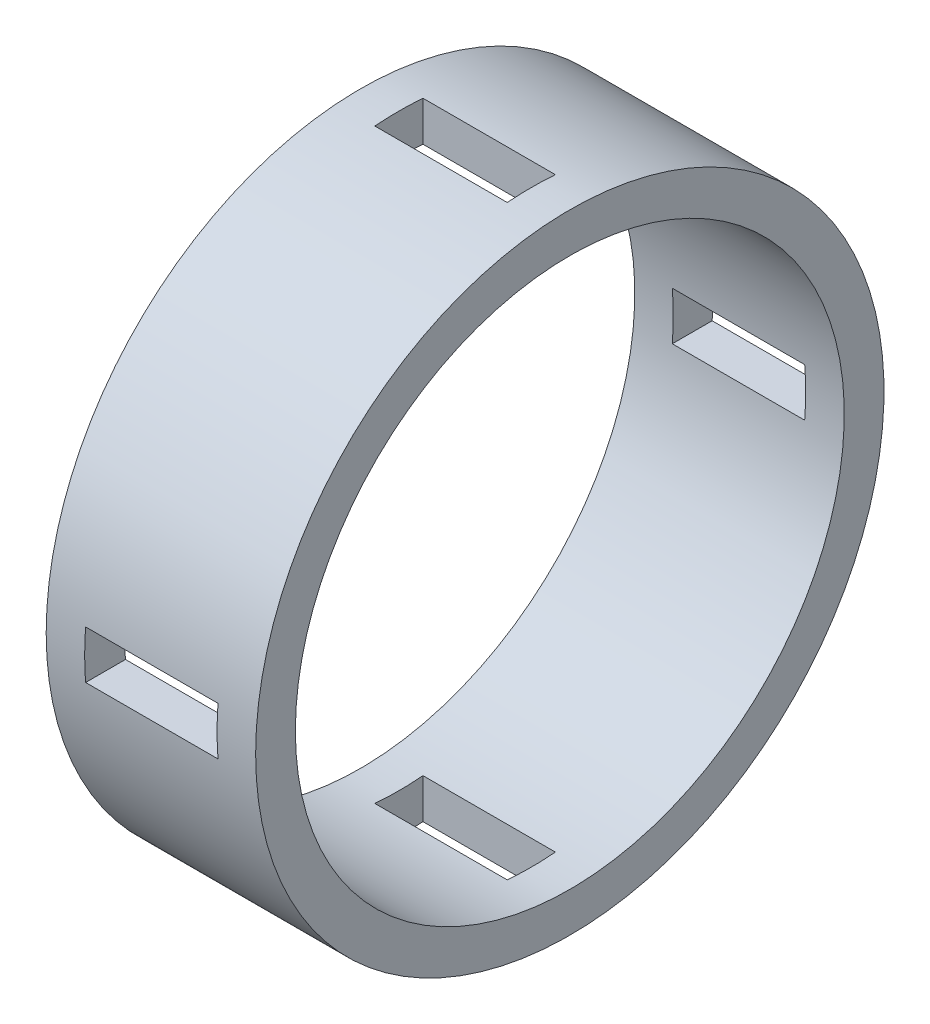
ISO-10303-21;
HEADER;
FILE_DESCRIPTION(('STEP AP214'),'2;1');
FILE_NAME('part.step','',(''),(''),'','','');
FILE_SCHEMA(('AUTOMOTIVE_DESIGN { 1 0 10303 214 1 1 1 1 }'));
ENDSEC;
DATA;
#1=APPLICATION_CONTEXT('core data for automotive mechanical design processes');
#2=APPLICATION_PROTOCOL_DEFINITION('international standard','automotive_design',2000,#1);
#3=PRODUCT_CONTEXT('',#1,'mechanical');
#4=PRODUCT('Part','Part','',(#3));
#5=PRODUCT_RELATED_PRODUCT_CATEGORY('part','',(#4));
#6=PRODUCT_DEFINITION_FORMATION('','',#4);
#7=PRODUCT_DEFINITION_CONTEXT('part definition',#1,'design');
#8=PRODUCT_DEFINITION('design','',#6,#7);
#9=PRODUCT_DEFINITION_SHAPE('','',#8);
#10=(LENGTH_UNIT() NAMED_UNIT(*) SI_UNIT(.MILLI.,.METRE.));
#11=(NAMED_UNIT(*) PLANE_ANGLE_UNIT() SI_UNIT($,.RADIAN.));
#12=(NAMED_UNIT(*) SI_UNIT($,.STERADIAN.) SOLID_ANGLE_UNIT());
#13=UNCERTAINTY_MEASURE_WITH_UNIT(LENGTH_MEASURE(1.E-05),#10,'distance_accuracy_value','');
#14=(GEOMETRIC_REPRESENTATION_CONTEXT(3) GLOBAL_UNCERTAINTY_ASSIGNED_CONTEXT((#13)) GLOBAL_UNIT_ASSIGNED_CONTEXT((#10,
#11,#12)) REPRESENTATION_CONTEXT('',''));
#15=CARTESIAN_POINT('',(0.,0.,0.));
#16=DIRECTION('',(0.,0.,1.));
#17=DIRECTION('',(1.,0.,0.));
#18=AXIS2_PLACEMENT_3D('',#15,#16,#17);
#19=CARTESIAN_POINT('',(31.05,2.,-24.5));
#20=DIRECTION('',(0.,-1.,0.));
#21=DIRECTION('',(0.,0.,-1.));
#22=AXIS2_PLACEMENT_3D('',#19,#20,#21);
#23=PLANE('',#22);
#24=DIRECTION('',(-1.,0.,0.));
#25=VECTOR('',#24,1.);
#26=CARTESIAN_POINT('',(31.05,2.00000000000001,-22.7121113065254));
#27=LINE('',#26,#25);
#28=CARTESIAN_POINT('',(36.55,2.,-22.7121113065254));
#29=VERTEX_POINT('',#28);
#30=CARTESIAN_POINT('',(25.55,2.,-22.7121113065254));
#31=VERTEX_POINT('',#30);
#32=EDGE_CURVE('E156',#29,#31,#27,.T.);
#33=ORIENTED_EDGE('',*,*,#32,.T.);
#34=DIRECTION('',(0.,0.,1.));
#35=VECTOR('',#34,1.);
#36=CARTESIAN_POINT('',(25.55,2.,-24.5));
#37=LINE('',#36,#35);
#38=CARTESIAN_POINT('',(25.55,2.,-26.0232588274413));
#39=VERTEX_POINT('',#38);
#40=EDGE_CURVE('E217',#39,#31,#37,.T.);
#41=ORIENTED_EDGE('',*,*,#40,.F.);
#42=DIRECTION('',(-1.,0.,0.));
#43=VECTOR('',#42,1.);
#44=CARTESIAN_POINT('',(31.05,1.99999999999999,-26.0232588274413));
#45=LINE('',#44,#43);
#46=CARTESIAN_POINT('',(36.55,2.,-26.0232588274413));
#47=VERTEX_POINT('',#46);
#48=EDGE_CURVE('E205',#47,#39,#45,.T.);
#49=ORIENTED_EDGE('',*,*,#48,.F.);
#50=DIRECTION('',(0.,0.,1.));
#51=VECTOR('',#50,1.);
#52=CARTESIAN_POINT('',(36.55,2.,-24.5));
#53=LINE('',#52,#51);
#54=EDGE_CURVE('E213',#47,#29,#53,.T.);
#55=ORIENTED_EDGE('',*,*,#54,.T.);
#56=EDGE_LOOP('',(#33,#41,#49,#55));
#57=FACE_BOUND('',#56,.T.);
#58=ADVANCED_FACE('F16',(#57),#23,.T.);
#59=CARTESIAN_POINT('',(25.55,24.5,0.));
#60=DIRECTION('',(1.,0.,0.));
#61=DIRECTION('',(0.,1.,0.));
#62=AXIS2_PLACEMENT_3D('',#59,#60,#61);
#63=PLANE('',#62);
#64=CARTESIAN_POINT('',(25.55,0.,0.));
#65=DIRECTION('',(-1.,0.,0.));
#66=DIRECTION('',(0.,0.,1.));
#67=AXIS2_PLACEMENT_3D('',#64,#65,#66);
#68=CIRCLE('',#67,22.8);
#69=CARTESIAN_POINT('',(25.55,22.7121113065254,2.));
#70=VERTEX_POINT('',#69);
#71=CARTESIAN_POINT('',(25.55,22.7121113065254,-2.));
#72=VERTEX_POINT('',#71);
#73=EDGE_CURVE('E151',#70,#72,#68,.T.);
#74=ORIENTED_EDGE('',*,*,#73,.T.);
#75=DIRECTION('',(0.,-1.,0.));
#76=VECTOR('',#75,1.);
#77=CARTESIAN_POINT('',(25.55,24.5,-2.));
#78=LINE('',#77,#76);
#79=CARTESIAN_POINT('',(25.55,26.0232588274413,-2.));
#80=VERTEX_POINT('',#79);
#81=EDGE_CURVE('E238',#80,#72,#78,.T.);
#82=ORIENTED_EDGE('',*,*,#81,.F.);
#83=CARTESIAN_POINT('',(25.55,0.,0.));
#84=DIRECTION('',(-1.,0.,0.));
#85=DIRECTION('',(0.,0.,1.));
#86=AXIS2_PLACEMENT_3D('',#83,#84,#85);
#87=CIRCLE('',#86,26.1);
#88=CARTESIAN_POINT('',(25.55,26.0232588274413,2.));
#89=VERTEX_POINT('',#88);
#90=EDGE_CURVE('E202',#89,#80,#87,.T.);
#91=ORIENTED_EDGE('',*,*,#90,.F.);
#92=DIRECTION('',(0.,1.,0.));
#93=VECTOR('',#92,1.);
#94=CARTESIAN_POINT('',(25.55,24.5,2.));
#95=LINE('',#94,#93);
#96=EDGE_CURVE('E147',#70,#89,#95,.T.);
#97=ORIENTED_EDGE('',*,*,#96,.F.);
#98=EDGE_LOOP('',(#74,#82,#91,#97));
#99=FACE_BOUND('',#98,.T.);
#100=ADVANCED_FACE('F354',(#99),#63,.T.);
#101=CARTESIAN_POINT('',(31.05,24.5,-2.));
#102=DIRECTION('',(0.,0.,1.));
#103=DIRECTION('',(0.,-1.,0.));
#104=AXIS2_PLACEMENT_3D('',#101,#102,#103);
#105=PLANE('',#104);
#106=DIRECTION('',(-1.,0.,0.));
#107=VECTOR('',#106,1.);
#108=CARTESIAN_POINT('',(31.05,22.7121113065254,-2.));
#109=LINE('',#108,#107);
#110=CARTESIAN_POINT('',(36.55,22.7121113065254,-2.));
#111=VERTEX_POINT('',#110);
#112=EDGE_CURVE('E125',#72,#111,#109,.F.);
#113=ORIENTED_EDGE('',*,*,#112,.T.);
#114=DIRECTION('',(0.,1.,0.));
#115=VECTOR('',#114,1.);
#116=CARTESIAN_POINT('',(36.55,24.5,-2.));
#117=LINE('',#116,#115);
#118=CARTESIAN_POINT('',(36.55,26.0232588274413,-2.));
#119=VERTEX_POINT('',#118);
#120=EDGE_CURVE('E135',#111,#119,#117,.T.);
#121=ORIENTED_EDGE('',*,*,#120,.T.);
#122=DIRECTION('',(-1.,0.,0.));
#123=VECTOR('',#122,1.);
#124=CARTESIAN_POINT('',(31.05,26.0232588274413,-2.));
#125=LINE('',#124,#123);
#126=EDGE_CURVE('E201',#80,#119,#125,.F.);
#127=ORIENTED_EDGE('',*,*,#126,.F.);
#128=ORIENTED_EDGE('',*,*,#81,.T.);
#129=EDGE_LOOP('',(#113,#121,#127,#128));
#130=FACE_BOUND('',#129,.T.);
#131=ADVANCED_FACE('F352',(#130),#105,.T.);
#132=CARTESIAN_POINT('',(36.55,24.5,0.));
#133=DIRECTION('',(1.,0.,0.));
#134=DIRECTION('',(0.,1.,0.));
#135=AXIS2_PLACEMENT_3D('',#132,#133,#134);
#136=PLANE('',#135);
#137=ORIENTED_EDGE('',*,*,#120,.F.);
#138=CARTESIAN_POINT('',(36.55,0.,0.));
#139=DIRECTION('',(-1.,0.,0.));
#140=DIRECTION('',(0.,0.,1.));
#141=AXIS2_PLACEMENT_3D('',#138,#139,#140);
#142=CIRCLE('',#141,22.8);
#143=CARTESIAN_POINT('',(36.55,22.7121113065254,2.));
#144=VERTEX_POINT('',#143);
#145=EDGE_CURVE('E19',#111,#144,#142,.F.);
#146=ORIENTED_EDGE('',*,*,#145,.T.);
#147=DIRECTION('',(0.,1.,0.));
#148=VECTOR('',#147,1.);
#149=CARTESIAN_POINT('',(36.55,24.5,2.));
#150=LINE('',#149,#148);
#151=CARTESIAN_POINT('',(36.55,26.0232588274413,2.));
#152=VERTEX_POINT('',#151);
#153=EDGE_CURVE('E133',#152,#144,#150,.F.);
#154=ORIENTED_EDGE('',*,*,#153,.F.);
#155=CARTESIAN_POINT('',(36.55,0.,0.));
#156=DIRECTION('',(-1.,0.,0.));
#157=DIRECTION('',(0.,0.,1.));
#158=AXIS2_PLACEMENT_3D('',#155,#156,#157);
#159=CIRCLE('',#158,26.1);
#160=EDGE_CURVE('E199',#119,#152,#159,.F.);
#161=ORIENTED_EDGE('',*,*,#160,.F.);
#162=EDGE_LOOP('',(#137,#146,#154,#161));
#163=FACE_BOUND('',#162,.T.);
#164=ADVANCED_FACE('F131',(#163),#136,.F.);
#165=CARTESIAN_POINT('',(31.05,24.5,2.));
#166=DIRECTION('',(0.,0.,-1.));
#167=DIRECTION('',(-1.,0.,0.));
#168=AXIS2_PLACEMENT_3D('',#165,#166,#167);
#169=PLANE('',#168);
#170=DIRECTION('',(-1.,0.,0.));
#171=VECTOR('',#170,1.);
#172=CARTESIAN_POINT('',(31.05,22.7121113065254,2.));
#173=LINE('',#172,#171);
#174=EDGE_CURVE('E138',#144,#70,#173,.T.);
#175=ORIENTED_EDGE('',*,*,#174,.T.);
#176=ORIENTED_EDGE('',*,*,#96,.T.);
#177=DIRECTION('',(-1.,0.,0.));
#178=VECTOR('',#177,1.);
#179=CARTESIAN_POINT('',(31.05,26.0232588274413,2.));
#180=LINE('',#179,#178);
#181=EDGE_CURVE('E145',#152,#89,#180,.T.);
#182=ORIENTED_EDGE('',*,*,#181,.F.);
#183=ORIENTED_EDGE('',*,*,#153,.T.);
#184=EDGE_LOOP('',(#175,#176,#182,#183));
#185=FACE_BOUND('',#184,.T.);
#186=ADVANCED_FACE('F141',(#185),#169,.T.);
#187=CARTESIAN_POINT('',(31.05,2.,24.5));
#188=DIRECTION('',(0.,-1.,0.));
#189=DIRECTION('',(1.,0.,0.));
#190=AXIS2_PLACEMENT_3D('',#187,#188,#189);
#191=PLANE('',#190);
#192=DIRECTION('',(1.,0.,0.));
#193=VECTOR('',#192,1.);
#194=CARTESIAN_POINT('',(31.05,2.,22.7121113065254));
#195=LINE('',#194,#193);
#196=CARTESIAN_POINT('',(25.55,2.,22.7121113065254));
#197=VERTEX_POINT('',#196);
#198=CARTESIAN_POINT('',(36.55,2.,22.7121113065254));
#199=VERTEX_POINT('',#198);
#200=EDGE_CURVE('E153',#197,#199,#195,.T.);
#201=ORIENTED_EDGE('',*,*,#200,.T.);
#202=DIRECTION('',(0.,0.,1.));
#203=VECTOR('',#202,1.);
#204=CARTESIAN_POINT('',(36.55,2.,24.5));
#205=LINE('',#204,#203);
#206=CARTESIAN_POINT('',(36.55,2.,26.0232588274413));
#207=VERTEX_POINT('',#206);
#208=EDGE_CURVE('E198',#199,#207,#205,.T.);
#209=ORIENTED_EDGE('',*,*,#208,.T.);
#210=DIRECTION('',(-1.,0.,0.));
#211=VECTOR('',#210,1.);
#212=CARTESIAN_POINT('',(31.05,2.,26.0232588274413));
#213=LINE('',#212,#211);
#214=CARTESIAN_POINT('',(25.55,2.,26.0232588274413));
#215=VERTEX_POINT('',#214);
#216=EDGE_CURVE('E209',#215,#207,#213,.F.);
#217=ORIENTED_EDGE('',*,*,#216,.F.);
#218=DIRECTION('',(0.,0.,1.));
#219=VECTOR('',#218,1.);
#220=CARTESIAN_POINT('',(25.55,2.,24.5));
#221=LINE('',#220,#219);
#222=EDGE_CURVE('E191',#197,#215,#221,.T.);
#223=ORIENTED_EDGE('',*,*,#222,.F.);
#224=EDGE_LOOP('',(#201,#209,#217,#223));
#225=FACE_BOUND('',#224,.T.);
#226=ADVANCED_FACE('F299',(#225),#191,.T.);
#227=CARTESIAN_POINT('',(31.05,0.,0.));
#228=DIRECTION('',(-1.,0.,0.));
#229=DIRECTION('',(0.,0.,1.));
#230=AXIS2_PLACEMENT_3D('',#227,#228,#229);
#231=CYLINDRICAL_SURFACE('',#230,22.8);
#232=CARTESIAN_POINT('',(25.55,0.,0.));
#233=DIRECTION('',(-1.,0.,0.));
#234=DIRECTION('',(0.,0.,1.));
#235=AXIS2_PLACEMENT_3D('',#232,#233,#234);
#236=CIRCLE('',#235,22.8);
#237=CARTESIAN_POINT('',(25.55,-2.,-22.7121113065254));
#238=VERTEX_POINT('',#237);
#239=EDGE_CURVE('E214',#31,#238,#236,.T.);
#240=ORIENTED_EDGE('',*,*,#239,.F.);
#241=ORIENTED_EDGE('',*,*,#32,.F.);
#242=CARTESIAN_POINT('',(36.55,0.,0.));
#243=DIRECTION('',(-1.,0.,0.));
#244=DIRECTION('',(0.,0.,1.));
#245=AXIS2_PLACEMENT_3D('',#242,#243,#244);
#246=CIRCLE('',#245,22.8);
#247=CARTESIAN_POINT('',(36.55,-2.,-22.7121113065254));
#248=VERTEX_POINT('',#247);
#249=EDGE_CURVE('E211',#29,#248,#246,.T.);
#250=ORIENTED_EDGE('',*,*,#249,.T.);
#251=DIRECTION('',(1.,0.,0.));
#252=VECTOR('',#251,1.);
#253=CARTESIAN_POINT('',(31.05,-2.,-22.7121113065254));
#254=LINE('',#253,#252);
#255=EDGE_CURVE('E245',#238,#248,#254,.T.);
#256=ORIENTED_EDGE('',*,*,#255,.F.);
#257=EDGE_LOOP('',(#240,#241,#250,#256));
#258=FACE_BOUND('',#257,.T.);
#259=CARTESIAN_POINT('',(39.75,0.,0.));
#260=DIRECTION('',(-1.,0.,0.));
#261=DIRECTION('',(0.,0.,1.));
#262=AXIS2_PLACEMENT_3D('',#259,#260,#261);
#263=CIRCLE('',#262,22.8);
#264=CARTESIAN_POINT('',(39.75,0.,22.8));
#265=VERTEX_POINT('',#264);
#266=EDGE_CURVE('E206',#265,#265,#263,.T.);
#267=ORIENTED_EDGE('',*,*,#266,.F.);
#268=EDGE_LOOP('',(#267));
#269=FACE_BOUND('',#268,.T.);
#270=DIRECTION('',(1.,0.,0.));
#271=VECTOR('',#270,1.);
#272=CARTESIAN_POINT('',(31.05,-2.,22.7121113065254));
#273=LINE('',#272,#271);
#274=CARTESIAN_POINT('',(36.55,-2.,22.7121113065254));
#275=VERTEX_POINT('',#274);
#276=CARTESIAN_POINT('',(25.55,-2.,22.7121113065254));
#277=VERTEX_POINT('',#276);
#278=EDGE_CURVE('E233',#275,#277,#273,.F.);
#279=ORIENTED_EDGE('',*,*,#278,.F.);
#280=CARTESIAN_POINT('',(36.55,0.,0.));
#281=DIRECTION('',(-1.,0.,0.));
#282=DIRECTION('',(0.,0.,1.));
#283=AXIS2_PLACEMENT_3D('',#280,#281,#282);
#284=CIRCLE('',#283,22.8);
#285=EDGE_CURVE('E196',#275,#199,#284,.T.);
#286=ORIENTED_EDGE('',*,*,#285,.T.);
#287=ORIENTED_EDGE('',*,*,#200,.F.);
#288=CARTESIAN_POINT('',(25.55,0.,0.));
#289=DIRECTION('',(-1.,0.,0.));
#290=DIRECTION('',(0.,0.,1.));
#291=AXIS2_PLACEMENT_3D('',#288,#289,#290);
#292=CIRCLE('',#291,22.8);
#293=EDGE_CURVE('E192',#277,#197,#292,.T.);
#294=ORIENTED_EDGE('',*,*,#293,.F.);
#295=EDGE_LOOP('',(#279,#286,#287,#294));
#296=FACE_BOUND('',#295,.T.);
#297=DIRECTION('',(1.,0.,0.));
#298=VECTOR('',#297,1.);
#299=CARTESIAN_POINT('',(31.05,-22.7121113065254,-2.));
#300=LINE('',#299,#298);
#301=CARTESIAN_POINT('',(36.55,-22.7121113065254,-2.));
#302=VERTEX_POINT('',#301);
#303=CARTESIAN_POINT('',(25.55,-22.7121113065254,-2.));
#304=VERTEX_POINT('',#303);
#305=EDGE_CURVE('E257',#302,#304,#300,.F.);
#306=ORIENTED_EDGE('',*,*,#305,.F.);
#307=CARTESIAN_POINT('',(36.55,0.,0.));
#308=DIRECTION('',(-1.,0.,0.));
#309=DIRECTION('',(0.,0.,1.));
#310=AXIS2_PLACEMENT_3D('',#307,#308,#309);
#311=CIRCLE('',#310,22.8);
#312=CARTESIAN_POINT('',(36.55,-22.7121113065254,2.));
#313=VERTEX_POINT('',#312);
#314=EDGE_CURVE('E184',#302,#313,#311,.T.);
#315=ORIENTED_EDGE('',*,*,#314,.T.);
#316=DIRECTION('',(-1.,0.,0.));
#317=VECTOR('',#316,1.);
#318=CARTESIAN_POINT('',(31.05,-22.7121113065254,2.));
#319=LINE('',#318,#317);
#320=CARTESIAN_POINT('',(25.55,-22.7121113065254,2.));
#321=VERTEX_POINT('',#320);
#322=EDGE_CURVE('E187',#321,#313,#319,.F.);
#323=ORIENTED_EDGE('',*,*,#322,.F.);
#324=CARTESIAN_POINT('',(25.55,0.,0.));
#325=DIRECTION('',(-1.,0.,0.));
#326=DIRECTION('',(0.,0.,1.));
#327=AXIS2_PLACEMENT_3D('',#324,#325,#326);
#328=CIRCLE('',#327,22.8);
#329=EDGE_CURVE('E188',#304,#321,#328,.T.);
#330=ORIENTED_EDGE('',*,*,#329,.F.);
#331=EDGE_LOOP('',(#306,#315,#323,#330));
#332=FACE_BOUND('',#331,.T.);
#333=CARTESIAN_POINT('',(22.35,0.,0.));
#334=DIRECTION('',(-1.,0.,0.));
#335=DIRECTION('',(0.,0.,1.));
#336=AXIS2_PLACEMENT_3D('',#333,#334,#335);
#337=CIRCLE('',#336,22.8);
#338=CARTESIAN_POINT('',(22.35,0.,22.8));
#339=VERTEX_POINT('',#338);
#340=EDGE_CURVE('E218',#339,#339,#337,.F.);
#341=ORIENTED_EDGE('',*,*,#340,.F.);
#342=EDGE_LOOP('',(#341));
#343=FACE_BOUND('',#342,.T.);
#344=ORIENTED_EDGE('',*,*,#174,.F.);
#345=ORIENTED_EDGE('',*,*,#145,.F.);
#346=ORIENTED_EDGE('',*,*,#112,.F.);
#347=ORIENTED_EDGE('',*,*,#73,.F.);
#348=EDGE_LOOP('',(#344,#345,#346,#347));
#349=FACE_BOUND('',#348,.T.);
#350=ADVANCED_FACE('F149',(#258,#269,#296,#332,#343,#349),#231,.F.);
#351=CARTESIAN_POINT('',(22.35,0.,24.45));
#352=DIRECTION('',(-1.,0.,0.));
#353=DIRECTION('',(0.,0.,1.));
#354=AXIS2_PLACEMENT_3D('',#351,#352,#353);
#355=PLANE('',#354);
#356=ORIENTED_EDGE('',*,*,#340,.T.);
#357=EDGE_LOOP('',(#356));
#358=FACE_BOUND('',#357,.T.);
#359=CARTESIAN_POINT('',(22.35,0.,0.));
#360=DIRECTION('',(-1.,0.,0.));
#361=DIRECTION('',(0.,0.,1.));
#362=AXIS2_PLACEMENT_3D('',#359,#360,#361);
#363=CIRCLE('',#362,26.1);
#364=CARTESIAN_POINT('',(22.35,0.,26.1));
#365=VERTEX_POINT('',#364);
#366=EDGE_CURVE('E180',#365,#365,#363,.F.);
#367=ORIENTED_EDGE('',*,*,#366,.F.);
#368=EDGE_LOOP('',(#367));
#369=FACE_BOUND('',#368,.T.);
#370=ADVANCED_FACE('F298',(#358,#369),#355,.T.);
#371=CARTESIAN_POINT('',(25.55,0.,-24.5));
#372=DIRECTION('',(1.,0.,0.));
#373=DIRECTION('',(0.,1.,0.));
#374=AXIS2_PLACEMENT_3D('',#371,#372,#373);
#375=PLANE('',#374);
#376=DIRECTION('',(0.,0.,1.));
#377=VECTOR('',#376,1.);
#378=CARTESIAN_POINT('',(25.55,-2.,-24.5));
#379=LINE('',#378,#377);
#380=CARTESIAN_POINT('',(25.55,-1.99999999999999,-26.0232588274413));
#381=VERTEX_POINT('',#380);
#382=EDGE_CURVE('E216',#381,#238,#379,.T.);
#383=ORIENTED_EDGE('',*,*,#382,.F.);
#384=CARTESIAN_POINT('',(25.55,0.,0.));
#385=DIRECTION('',(-1.,0.,0.));
#386=DIRECTION('',(0.,0.,1.));
#387=AXIS2_PLACEMENT_3D('',#384,#385,#386);
#388=CIRCLE('',#387,26.1);
#389=EDGE_CURVE('E177',#39,#381,#388,.T.);
#390=ORIENTED_EDGE('',*,*,#389,.F.);
#391=ORIENTED_EDGE('',*,*,#40,.T.);
#392=ORIENTED_EDGE('',*,*,#239,.T.);
#393=EDGE_LOOP('',(#383,#390,#391,#392));
#394=FACE_BOUND('',#393,.T.);
#395=ADVANCED_FACE('F291',(#394),#375,.T.);
#396=CARTESIAN_POINT('',(31.05,-2.,-24.5));
#397=DIRECTION('',(0.,1.,0.));
#398=DIRECTION('',(0.,0.,1.));
#399=AXIS2_PLACEMENT_3D('',#396,#397,#398);
#400=PLANE('',#399);
#401=ORIENTED_EDGE('',*,*,#255,.T.);
#402=DIRECTION('',(0.,0.,1.));
#403=VECTOR('',#402,1.);
#404=CARTESIAN_POINT('',(36.55,-2.,-24.5));
#405=LINE('',#404,#403);
#406=CARTESIAN_POINT('',(36.55,-1.99999999999999,-26.0232588274413));
#407=VERTEX_POINT('',#406);
#408=EDGE_CURVE('E210',#248,#407,#405,.F.);
#409=ORIENTED_EDGE('',*,*,#408,.T.);
#410=DIRECTION('',(-1.,0.,0.));
#411=VECTOR('',#410,1.);
#412=CARTESIAN_POINT('',(31.05,-1.99999999999999,-26.0232588274413));
#413=LINE('',#412,#411);
#414=EDGE_CURVE('E176',#381,#407,#413,.F.);
#415=ORIENTED_EDGE('',*,*,#414,.F.);
#416=ORIENTED_EDGE('',*,*,#382,.T.);
#417=EDGE_LOOP('',(#401,#409,#415,#416));
#418=FACE_BOUND('',#417,.T.);
#419=ADVANCED_FACE('F280',(#418),#400,.T.);
#420=CARTESIAN_POINT('',(36.55,0.,-24.5));
#421=DIRECTION('',(1.,0.,0.));
#422=DIRECTION('',(0.,1.,0.));
#423=AXIS2_PLACEMENT_3D('',#420,#421,#422);
#424=PLANE('',#423);
#425=ORIENTED_EDGE('',*,*,#408,.F.);
#426=ORIENTED_EDGE('',*,*,#249,.F.);
#427=ORIENTED_EDGE('',*,*,#54,.F.);
#428=CARTESIAN_POINT('',(36.55,0.,0.));
#429=DIRECTION('',(-1.,0.,0.));
#430=DIRECTION('',(0.,0.,1.));
#431=AXIS2_PLACEMENT_3D('',#428,#429,#430);
#432=CIRCLE('',#431,26.1);
#433=EDGE_CURVE('E174',#407,#47,#432,.F.);
#434=ORIENTED_EDGE('',*,*,#433,.F.);
#435=EDGE_LOOP('',(#425,#426,#427,#434));
#436=FACE_BOUND('',#435,.T.);
#437=ADVANCED_FACE('F284',(#436),#424,.F.);
#438=CARTESIAN_POINT('',(39.75,0.,24.45));
#439=DIRECTION('',(1.,0.,0.));
#440=DIRECTION('',(0.,0.,-1.));
#441=AXIS2_PLACEMENT_3D('',#438,#439,#440);
#442=PLANE('',#441);
#443=ORIENTED_EDGE('',*,*,#266,.T.);
#444=EDGE_LOOP('',(#443));
#445=FACE_BOUND('',#444,.T.);
#446=CARTESIAN_POINT('',(39.75,0.,0.));
#447=DIRECTION('',(-1.,0.,0.));
#448=DIRECTION('',(0.,0.,1.));
#449=AXIS2_PLACEMENT_3D('',#446,#447,#448);
#450=CIRCLE('',#449,26.1);
#451=CARTESIAN_POINT('',(39.75,0.,26.1));
#452=VERTEX_POINT('',#451);
#453=EDGE_CURVE('E171',#452,#452,#450,.T.);
#454=ORIENTED_EDGE('',*,*,#453,.F.);
#455=EDGE_LOOP('',(#454));
#456=FACE_BOUND('',#455,.T.);
#457=ADVANCED_FACE('F429',(#445,#456),#442,.T.);
#458=CARTESIAN_POINT('',(36.55,0.,24.5));
#459=DIRECTION('',(1.,0.,0.));
#460=DIRECTION('',(0.,1.,0.));
#461=AXIS2_PLACEMENT_3D('',#458,#459,#460);
#462=PLANE('',#461);
#463=ORIENTED_EDGE('',*,*,#208,.F.);
#464=ORIENTED_EDGE('',*,*,#285,.F.);
#465=DIRECTION('',(0.,0.,1.));
#466=VECTOR('',#465,1.);
#467=CARTESIAN_POINT('',(36.55,-2.,24.5));
#468=LINE('',#467,#466);
#469=CARTESIAN_POINT('',(36.55,-2.,26.0232588274413));
#470=VERTEX_POINT('',#469);
#471=EDGE_CURVE('E236',#470,#275,#468,.F.);
#472=ORIENTED_EDGE('',*,*,#471,.F.);
#473=CARTESIAN_POINT('',(36.55,0.,0.));
#474=DIRECTION('',(-1.,0.,0.));
#475=DIRECTION('',(0.,0.,1.));
#476=AXIS2_PLACEMENT_3D('',#473,#474,#475);
#477=CIRCLE('',#476,26.1);
#478=EDGE_CURVE('E168',#207,#470,#477,.F.);
#479=ORIENTED_EDGE('',*,*,#478,.F.);
#480=EDGE_LOOP('',(#463,#464,#472,#479));
#481=FACE_BOUND('',#480,.T.);
#482=ADVANCED_FACE('F438',(#481),#462,.F.);
#483=CARTESIAN_POINT('',(31.05,-2.,24.5));
#484=DIRECTION('',(0.,1.,0.));
#485=DIRECTION('',(0.,0.,1.));
#486=AXIS2_PLACEMENT_3D('',#483,#484,#485);
#487=PLANE('',#486);
#488=ORIENTED_EDGE('',*,*,#278,.T.);
#489=DIRECTION('',(0.,0.,1.));
#490=VECTOR('',#489,1.);
#491=CARTESIAN_POINT('',(25.55,-2.,24.5));
#492=LINE('',#491,#490);
#493=CARTESIAN_POINT('',(25.55,-2.,26.0232588274413));
#494=VERTEX_POINT('',#493);
#495=EDGE_CURVE('E195',#494,#277,#492,.F.);
#496=ORIENTED_EDGE('',*,*,#495,.F.);
#497=DIRECTION('',(-1.,0.,0.));
#498=VECTOR('',#497,1.);
#499=CARTESIAN_POINT('',(31.05,-2.,26.0232588274413));
#500=LINE('',#499,#498);
#501=EDGE_CURVE('E167',#470,#494,#500,.T.);
#502=ORIENTED_EDGE('',*,*,#501,.F.);
#503=ORIENTED_EDGE('',*,*,#471,.T.);
#504=EDGE_LOOP('',(#488,#496,#502,#503));
#505=FACE_BOUND('',#504,.T.);
#506=ADVANCED_FACE('F448',(#505),#487,.T.);
#507=CARTESIAN_POINT('',(25.55,0.,24.5));
#508=DIRECTION('',(1.,0.,0.));
#509=DIRECTION('',(0.,1.,0.));
#510=AXIS2_PLACEMENT_3D('',#507,#508,#509);
#511=PLANE('',#510);
#512=ORIENTED_EDGE('',*,*,#222,.T.);
#513=CARTESIAN_POINT('',(25.55,0.,0.));
#514=DIRECTION('',(-1.,0.,0.));
#515=DIRECTION('',(0.,0.,1.));
#516=AXIS2_PLACEMENT_3D('',#513,#514,#515);
#517=CIRCLE('',#516,26.1);
#518=EDGE_CURVE('E165',#494,#215,#517,.T.);
#519=ORIENTED_EDGE('',*,*,#518,.F.);
#520=ORIENTED_EDGE('',*,*,#495,.T.);
#521=ORIENTED_EDGE('',*,*,#293,.T.);
#522=EDGE_LOOP('',(#512,#519,#520,#521));
#523=FACE_BOUND('',#522,.T.);
#524=ADVANCED_FACE('F326',(#523),#511,.T.);
#525=CARTESIAN_POINT('',(25.55,-24.5,0.));
#526=DIRECTION('',(1.,0.,0.));
#527=DIRECTION('',(0.,0.,-1.));
#528=AXIS2_PLACEMENT_3D('',#525,#526,#527);
#529=PLANE('',#528);
#530=ORIENTED_EDGE('',*,*,#329,.T.);
#531=DIRECTION('',(0.,1.,0.));
#532=VECTOR('',#531,1.);
#533=CARTESIAN_POINT('',(25.55,-24.5,2.));
#534=LINE('',#533,#532);
#535=CARTESIAN_POINT('',(25.55,-26.0232588274413,1.99999999999999));
#536=VERTEX_POINT('',#535);
#537=EDGE_CURVE('E190',#536,#321,#534,.T.);
#538=ORIENTED_EDGE('',*,*,#537,.F.);
#539=CARTESIAN_POINT('',(25.55,0.,0.));
#540=DIRECTION('',(-1.,0.,0.));
#541=DIRECTION('',(0.,0.,1.));
#542=AXIS2_PLACEMENT_3D('',#539,#540,#541);
#543=CIRCLE('',#542,26.1);
#544=CARTESIAN_POINT('',(25.55,-26.0232588274413,-2.00000000000001));
#545=VERTEX_POINT('',#544);
#546=EDGE_CURVE('E162',#545,#536,#543,.T.);
#547=ORIENTED_EDGE('',*,*,#546,.F.);
#548=DIRECTION('',(0.,-1.,0.));
#549=VECTOR('',#548,1.);
#550=CARTESIAN_POINT('',(25.55,-24.5,-2.));
#551=LINE('',#550,#549);
#552=EDGE_CURVE('E183',#304,#545,#551,.T.);
#553=ORIENTED_EDGE('',*,*,#552,.F.);
#554=EDGE_LOOP('',(#530,#538,#547,#553));
#555=FACE_BOUND('',#554,.T.);
#556=ADVANCED_FACE('F318',(#555),#529,.T.);
#557=CARTESIAN_POINT('',(31.05,-24.5,2.));
#558=DIRECTION('',(0.,0.,-1.));
#559=DIRECTION('',(-1.,0.,0.));
#560=AXIS2_PLACEMENT_3D('',#557,#558,#559);
#561=PLANE('',#560);
#562=ORIENTED_EDGE('',*,*,#322,.T.);
#563=DIRECTION('',(0.,1.,0.));
#564=VECTOR('',#563,1.);
#565=CARTESIAN_POINT('',(36.55,-24.5,2.));
#566=LINE('',#565,#564);
#567=CARTESIAN_POINT('',(36.55,-26.0232588274413,1.99999999999999));
#568=VERTEX_POINT('',#567);
#569=EDGE_CURVE('E186',#313,#568,#566,.F.);
#570=ORIENTED_EDGE('',*,*,#569,.T.);
#571=DIRECTION('',(-1.,0.,0.));
#572=VECTOR('',#571,1.);
#573=CARTESIAN_POINT('',(31.05,-26.0232588274413,1.99999999999999));
#574=LINE('',#573,#572);
#575=EDGE_CURVE('E161',#536,#568,#574,.F.);
#576=ORIENTED_EDGE('',*,*,#575,.F.);
#577=ORIENTED_EDGE('',*,*,#537,.T.);
#578=EDGE_LOOP('',(#562,#570,#576,#577));
#579=FACE_BOUND('',#578,.T.);
#580=ADVANCED_FACE('F315',(#579),#561,.T.);
#581=CARTESIAN_POINT('',(36.55,-24.5,0.));
#582=DIRECTION('',(1.,0.,0.));
#583=DIRECTION('',(0.,0.,-1.));
#584=AXIS2_PLACEMENT_3D('',#581,#582,#583);
#585=PLANE('',#584);
#586=ORIENTED_EDGE('',*,*,#569,.F.);
#587=ORIENTED_EDGE('',*,*,#314,.F.);
#588=DIRECTION('',(0.,-1.,0.));
#589=VECTOR('',#588,1.);
#590=CARTESIAN_POINT('',(36.55,-24.5,-2.));
#591=LINE('',#590,#589);
#592=CARTESIAN_POINT('',(36.55,-26.0232588274413,-2.00000000000001));
#593=VERTEX_POINT('',#592);
#594=EDGE_CURVE('E34',#593,#302,#591,.F.);
#595=ORIENTED_EDGE('',*,*,#594,.F.);
#596=CARTESIAN_POINT('',(36.55,0.,0.));
#597=DIRECTION('',(-1.,0.,0.));
#598=DIRECTION('',(0.,0.,1.));
#599=AXIS2_PLACEMENT_3D('',#596,#597,#598);
#600=CIRCLE('',#599,26.1);
#601=EDGE_CURVE('E25',#568,#593,#600,.F.);
#602=ORIENTED_EDGE('',*,*,#601,.F.);
#603=EDGE_LOOP('',(#586,#587,#595,#602));
#604=FACE_BOUND('',#603,.T.);
#605=ADVANCED_FACE('F317',(#604),#585,.F.);
#606=CARTESIAN_POINT('',(31.05,-24.5,-2.));
#607=DIRECTION('',(0.,0.,1.));
#608=DIRECTION('',(0.,-1.,0.));
#609=AXIS2_PLACEMENT_3D('',#606,#607,#608);
#610=PLANE('',#609);
#611=ORIENTED_EDGE('',*,*,#305,.T.);
#612=ORIENTED_EDGE('',*,*,#552,.T.);
#613=DIRECTION('',(-1.,0.,0.));
#614=VECTOR('',#613,1.);
#615=CARTESIAN_POINT('',(31.05,-26.0232588274413,-2.00000000000002));
#616=LINE('',#615,#614);
#617=EDGE_CURVE('E11',#593,#545,#616,.T.);
#618=ORIENTED_EDGE('',*,*,#617,.F.);
#619=ORIENTED_EDGE('',*,*,#594,.T.);
#620=EDGE_LOOP('',(#611,#612,#618,#619));
#621=FACE_BOUND('',#620,.T.);
#622=ADVANCED_FACE('F309',(#621),#610,.T.);
#623=CARTESIAN_POINT('',(31.05,0.,0.));
#624=DIRECTION('',(-1.,0.,0.));
#625=DIRECTION('',(0.,0.,1.));
#626=AXIS2_PLACEMENT_3D('',#623,#624,#625);
#627=CYLINDRICAL_SURFACE('',#626,26.1);
#628=ORIENTED_EDGE('',*,*,#366,.T.);
#629=EDGE_LOOP('',(#628));
#630=FACE_BOUND('',#629,.T.);
#631=ORIENTED_EDGE('',*,*,#48,.T.);
#632=ORIENTED_EDGE('',*,*,#389,.T.);
#633=ORIENTED_EDGE('',*,*,#414,.T.);
#634=ORIENTED_EDGE('',*,*,#433,.T.);
#635=EDGE_LOOP('',(#631,#632,#633,#634));
#636=FACE_BOUND('',#635,.T.);
#637=ORIENTED_EDGE('',*,*,#453,.T.);
#638=EDGE_LOOP('',(#637));
#639=FACE_BOUND('',#638,.T.);
#640=ORIENTED_EDGE('',*,*,#601,.T.);
#641=ORIENTED_EDGE('',*,*,#617,.T.);
#642=ORIENTED_EDGE('',*,*,#546,.T.);
#643=ORIENTED_EDGE('',*,*,#575,.T.);
#644=EDGE_LOOP('',(#640,#641,#642,#643));
#645=FACE_BOUND('',#644,.T.);
#646=ORIENTED_EDGE('',*,*,#501,.T.);
#647=ORIENTED_EDGE('',*,*,#518,.T.);
#648=ORIENTED_EDGE('',*,*,#216,.T.);
#649=ORIENTED_EDGE('',*,*,#478,.T.);
#650=EDGE_LOOP('',(#646,#647,#648,#649));
#651=FACE_BOUND('',#650,.T.);
#652=ORIENTED_EDGE('',*,*,#160,.T.);
#653=ORIENTED_EDGE('',*,*,#181,.T.);
#654=ORIENTED_EDGE('',*,*,#90,.T.);
#655=ORIENTED_EDGE('',*,*,#126,.T.);
#656=EDGE_LOOP('',(#652,#653,#654,#655));
#657=FACE_BOUND('',#656,.T.);
#658=ADVANCED_FACE('F287',(#630,#636,#639,#645,#651,#657),#627,.T.);
#659=CLOSED_SHELL('',(#58,#100,#131,#164,#186,#226,#350,#370,#395,#419,#437,#457,#482,#506,#524,
#556,#580,#605,#622,#658));
#660=MANIFOLD_SOLID_BREP('B1',#659);
#661=ADVANCED_BREP_SHAPE_REPRESENTATION('',(#18,#660),#14);
#662=SHAPE_DEFINITION_REPRESENTATION(#9,#661);
ENDSEC;
END-ISO-10303-21;
